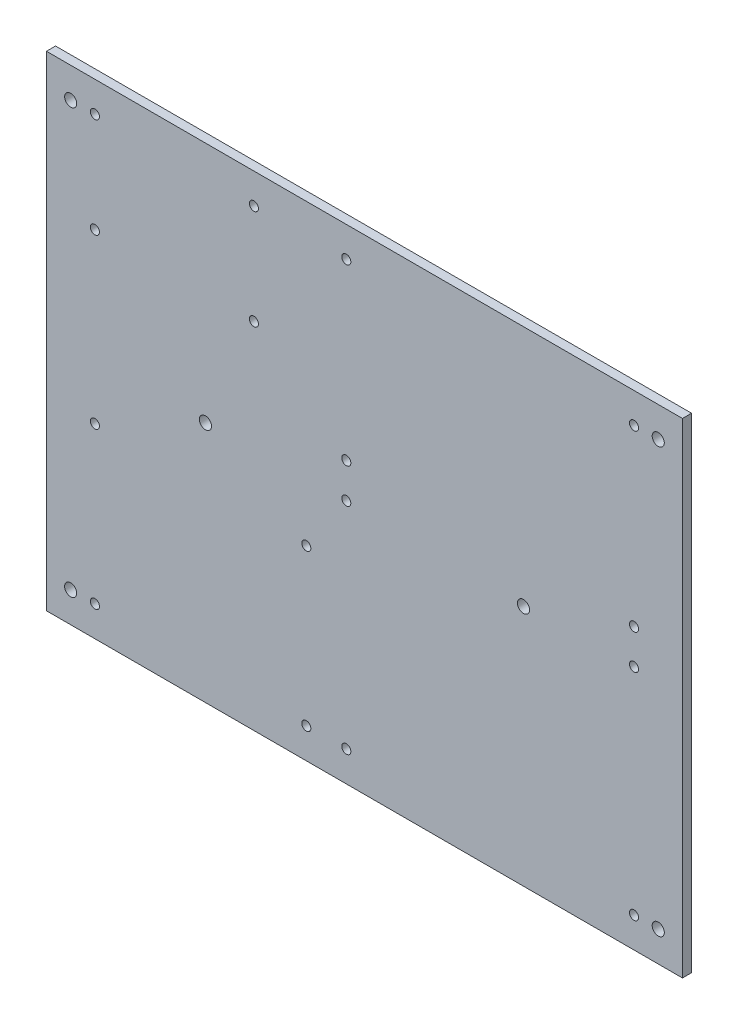
ISO-10303-21;
HEADER;
FILE_DESCRIPTION(('STEP AP214'),'2;1');
FILE_NAME('part.step','',(''),(''),'','','');
FILE_SCHEMA(('AUTOMOTIVE_DESIGN { 1 0 10303 214 1 1 1 1 }'));
ENDSEC;
DATA;
#1=APPLICATION_CONTEXT('core data for automotive mechanical design processes');
#2=APPLICATION_PROTOCOL_DEFINITION('international standard','automotive_design',2000,#1);
#3=PRODUCT_CONTEXT('',#1,'mechanical');
#4=PRODUCT('Part','Part','',(#3));
#5=PRODUCT_RELATED_PRODUCT_CATEGORY('part','',(#4));
#6=PRODUCT_DEFINITION_FORMATION('','',#4);
#7=PRODUCT_DEFINITION_CONTEXT('part definition',#1,'design');
#8=PRODUCT_DEFINITION('design','',#6,#7);
#9=PRODUCT_DEFINITION_SHAPE('','',#8);
#10=(LENGTH_UNIT() NAMED_UNIT(*) SI_UNIT(.MILLI.,.METRE.));
#11=(NAMED_UNIT(*) PLANE_ANGLE_UNIT() SI_UNIT($,.RADIAN.));
#12=(NAMED_UNIT(*) SI_UNIT($,.STERADIAN.) SOLID_ANGLE_UNIT());
#13=UNCERTAINTY_MEASURE_WITH_UNIT(LENGTH_MEASURE(1.E-05),#10,'distance_accuracy_value','');
#14=(GEOMETRIC_REPRESENTATION_CONTEXT(3) GLOBAL_UNCERTAINTY_ASSIGNED_CONTEXT((#13)) GLOBAL_UNIT_ASSIGNED_CONTEXT((#10,
#11,#12)) REPRESENTATION_CONTEXT('',''));
#15=CARTESIAN_POINT('',(0.,0.,0.));
#16=DIRECTION('',(0.,0.,1.));
#17=DIRECTION('',(1.,0.,0.));
#18=AXIS2_PLACEMENT_3D('',#15,#16,#17);
#19=CARTESIAN_POINT('',(105.,0.,3.));
#20=DIRECTION('',(1.,0.,0.));
#21=DIRECTION('',(0.,1.,0.));
#22=AXIS2_PLACEMENT_3D('',#19,#20,#21);
#23=PLANE('',#22);
#24=DIRECTION('',(0.,-1.,0.));
#25=VECTOR('',#24,1.);
#26=CARTESIAN_POINT('',(105.,0.,0.));
#27=LINE('',#26,#25);
#28=CARTESIAN_POINT('',(105.,80.,0.));
#29=VERTEX_POINT('',#28);
#30=CARTESIAN_POINT('',(105.,-80.,0.));
#31=VERTEX_POINT('',#30);
#32=EDGE_CURVE('E144',#29,#31,#27,.T.);
#33=ORIENTED_EDGE('',*,*,#32,.F.);
#34=DIRECTION('',(0.,0.,-1.));
#35=VECTOR('',#34,1.);
#36=CARTESIAN_POINT('',(105.,80.,3.));
#37=LINE('',#36,#35);
#38=CARTESIAN_POINT('',(105.,80.,3.));
#39=VERTEX_POINT('',#38);
#40=EDGE_CURVE('E11',#39,#29,#37,.T.);
#41=ORIENTED_EDGE('',*,*,#40,.F.);
#42=DIRECTION('',(0.,-1.,0.));
#43=VECTOR('',#42,1.);
#44=CARTESIAN_POINT('',(105.,0.,3.));
#45=LINE('',#44,#43);
#46=CARTESIAN_POINT('',(105.,-80.,3.));
#47=VERTEX_POINT('',#46);
#48=EDGE_CURVE('E109',#39,#47,#45,.T.);
#49=ORIENTED_EDGE('',*,*,#48,.T.);
#50=DIRECTION('',(0.,0.,-1.));
#51=VECTOR('',#50,1.);
#52=CARTESIAN_POINT('',(105.,-80.,3.));
#53=LINE('',#52,#51);
#54=EDGE_CURVE('E84',#47,#31,#53,.T.);
#55=ORIENTED_EDGE('',*,*,#54,.T.);
#56=EDGE_LOOP('',(#33,#41,#49,#55));
#57=FACE_BOUND('',#56,.T.);
#58=ADVANCED_FACE('F41',(#57),#23,.T.);
#59=CARTESIAN_POINT('',(0.,80.,3.));
#60=DIRECTION('',(0.,1.,0.));
#61=DIRECTION('',(0.,0.,1.));
#62=AXIS2_PLACEMENT_3D('',#59,#60,#61);
#63=PLANE('',#62);
#64=DIRECTION('',(1.,0.,0.));
#65=VECTOR('',#64,1.);
#66=CARTESIAN_POINT('',(0.,80.,0.));
#67=LINE('',#66,#65);
#68=CARTESIAN_POINT('',(-105.,80.,0.));
#69=VERTEX_POINT('',#68);
#70=EDGE_CURVE('E96',#69,#29,#67,.T.);
#71=ORIENTED_EDGE('',*,*,#70,.F.);
#72=DIRECTION('',(0.,0.,-1.));
#73=VECTOR('',#72,1.);
#74=CARTESIAN_POINT('',(-105.,80.,3.));
#75=LINE('',#74,#73);
#76=CARTESIAN_POINT('',(-105.,80.,3.));
#77=VERTEX_POINT('',#76);
#78=EDGE_CURVE('E52',#77,#69,#75,.T.);
#79=ORIENTED_EDGE('',*,*,#78,.F.);
#80=DIRECTION('',(1.,0.,0.));
#81=VECTOR('',#80,1.);
#82=CARTESIAN_POINT('',(0.,80.,3.));
#83=LINE('',#82,#81);
#84=EDGE_CURVE('E94',#77,#39,#83,.T.);
#85=ORIENTED_EDGE('',*,*,#84,.T.);
#86=ORIENTED_EDGE('',*,*,#40,.T.);
#87=EDGE_LOOP('',(#71,#79,#85,#86));
#88=FACE_BOUND('',#87,.T.);
#89=ADVANCED_FACE('F92',(#88),#63,.T.);
#90=CARTESIAN_POINT('',(-105.,0.,3.));
#91=DIRECTION('',(1.,0.,0.));
#92=DIRECTION('',(0.,0.,-1.));
#93=AXIS2_PLACEMENT_3D('',#90,#91,#92);
#94=PLANE('',#93);
#95=DIRECTION('',(0.,-1.,0.));
#96=VECTOR('',#95,1.);
#97=CARTESIAN_POINT('',(-105.,0.,0.));
#98=LINE('',#97,#96);
#99=CARTESIAN_POINT('',(-105.,-80.,0.));
#100=VERTEX_POINT('',#99);
#101=EDGE_CURVE('E149',#69,#100,#98,.T.);
#102=ORIENTED_EDGE('',*,*,#101,.T.);
#103=DIRECTION('',(0.,0.,-1.));
#104=VECTOR('',#103,1.);
#105=CARTESIAN_POINT('',(-105.,-80.,3.));
#106=LINE('',#105,#104);
#107=CARTESIAN_POINT('',(-105.,-80.,3.));
#108=VERTEX_POINT('',#107);
#109=EDGE_CURVE('E100',#108,#100,#106,.T.);
#110=ORIENTED_EDGE('',*,*,#109,.F.);
#111=DIRECTION('',(0.,-1.,0.));
#112=VECTOR('',#111,1.);
#113=CARTESIAN_POINT('',(-105.,0.,3.));
#114=LINE('',#113,#112);
#115=EDGE_CURVE('E103',#77,#108,#114,.T.);
#116=ORIENTED_EDGE('',*,*,#115,.F.);
#117=ORIENTED_EDGE('',*,*,#78,.T.);
#118=EDGE_LOOP('',(#102,#110,#116,#117));
#119=FACE_BOUND('',#118,.T.);
#120=ADVANCED_FACE('F104',(#119),#94,.F.);
#121=CARTESIAN_POINT('',(-52.5,0.,3.));
#122=DIRECTION('',(0.,0.,-1.));
#123=DIRECTION('',(-1.,0.,0.));
#124=AXIS2_PLACEMENT_3D('',#121,#122,#123);
#125=CYLINDRICAL_SURFACE('',#124,2.);
#126=CARTESIAN_POINT('',(-52.5,0.,3.));
#127=DIRECTION('',(0.,0.,1.));
#128=DIRECTION('',(1.,0.,0.));
#129=AXIS2_PLACEMENT_3D('',#126,#127,#128);
#130=CIRCLE('',#129,2.);
#131=CARTESIAN_POINT('',(-50.5,0.,3.));
#132=VERTEX_POINT('',#131);
#133=EDGE_CURVE('E127',#132,#132,#130,.T.);
#134=ORIENTED_EDGE('',*,*,#133,.T.);
#135=EDGE_LOOP('',(#134));
#136=FACE_BOUND('',#135,.T.);
#137=CARTESIAN_POINT('',(-52.5,0.,0.));
#138=DIRECTION('',(0.,0.,1.));
#139=DIRECTION('',(1.,0.,0.));
#140=AXIS2_PLACEMENT_3D('',#137,#138,#139);
#141=CIRCLE('',#140,2.);
#142=CARTESIAN_POINT('',(-50.5,0.,0.));
#143=VERTEX_POINT('',#142);
#144=EDGE_CURVE('E162',#143,#143,#141,.T.);
#145=ORIENTED_EDGE('',*,*,#144,.F.);
#146=EDGE_LOOP('',(#145));
#147=FACE_BOUND('',#146,.T.);
#148=ADVANCED_FACE('F338',(#136,#147),#125,.F.);
#149=CARTESIAN_POINT('',(-97.,-70.,3.));
#150=DIRECTION('',(0.,0.,-1.));
#151=DIRECTION('',(-1.,0.,0.));
#152=AXIS2_PLACEMENT_3D('',#149,#150,#151);
#153=CYLINDRICAL_SURFACE('',#152,2.);
#154=CARTESIAN_POINT('',(-97.,-70.,3.));
#155=DIRECTION('',(0.,0.,1.));
#156=DIRECTION('',(1.,0.,0.));
#157=AXIS2_PLACEMENT_3D('',#154,#155,#156);
#158=CIRCLE('',#157,2.);
#159=CARTESIAN_POINT('',(-95.,-70.,3.));
#160=VERTEX_POINT('',#159);
#161=EDGE_CURVE('E123',#160,#160,#158,.F.);
#162=ORIENTED_EDGE('',*,*,#161,.F.);
#163=EDGE_LOOP('',(#162));
#164=FACE_BOUND('',#163,.T.);
#165=CARTESIAN_POINT('',(-97.,-70.,0.));
#166=DIRECTION('',(0.,0.,1.));
#167=DIRECTION('',(1.,0.,0.));
#168=AXIS2_PLACEMENT_3D('',#165,#166,#167);
#169=CIRCLE('',#168,2.);
#170=CARTESIAN_POINT('',(-95.,-70.,0.));
#171=VERTEX_POINT('',#170);
#172=EDGE_CURVE('E158',#171,#171,#169,.F.);
#173=ORIENTED_EDGE('',*,*,#172,.T.);
#174=EDGE_LOOP('',(#173));
#175=FACE_BOUND('',#174,.T.);
#176=ADVANCED_FACE('F333',(#164,#175),#153,.F.);
#177=CARTESIAN_POINT('',(-97.,70.,3.));
#178=DIRECTION('',(0.,0.,-1.));
#179=DIRECTION('',(-1.,0.,0.));
#180=AXIS2_PLACEMENT_3D('',#177,#178,#179);
#181=CYLINDRICAL_SURFACE('',#180,2.);
#182=CARTESIAN_POINT('',(-97.,70.,3.));
#183=DIRECTION('',(0.,0.,1.));
#184=DIRECTION('',(1.,0.,0.));
#185=AXIS2_PLACEMENT_3D('',#182,#183,#184);
#186=CIRCLE('',#185,2.);
#187=CARTESIAN_POINT('',(-95.,70.,3.));
#188=VERTEX_POINT('',#187);
#189=EDGE_CURVE('E119',#188,#188,#186,.T.);
#190=ORIENTED_EDGE('',*,*,#189,.T.);
#191=EDGE_LOOP('',(#190));
#192=FACE_BOUND('',#191,.T.);
#193=CARTESIAN_POINT('',(-97.,70.,0.));
#194=DIRECTION('',(0.,0.,1.));
#195=DIRECTION('',(1.,0.,0.));
#196=AXIS2_PLACEMENT_3D('',#193,#194,#195);
#197=CIRCLE('',#196,2.);
#198=CARTESIAN_POINT('',(-95.,70.,0.));
#199=VERTEX_POINT('',#198);
#200=EDGE_CURVE('E154',#199,#199,#197,.T.);
#201=ORIENTED_EDGE('',*,*,#200,.F.);
#202=EDGE_LOOP('',(#201));
#203=FACE_BOUND('',#202,.T.);
#204=ADVANCED_FACE('F327',(#192,#203),#181,.F.);
#205=CARTESIAN_POINT('',(0.,-80.,3.));
#206=DIRECTION('',(0.,1.,0.));
#207=DIRECTION('',(0.,0.,1.));
#208=AXIS2_PLACEMENT_3D('',#205,#206,#207);
#209=PLANE('',#208);
#210=DIRECTION('',(1.,0.,0.));
#211=VECTOR('',#210,1.);
#212=CARTESIAN_POINT('',(0.,-80.,0.));
#213=LINE('',#212,#211);
#214=EDGE_CURVE('E77',#100,#31,#213,.T.);
#215=ORIENTED_EDGE('',*,*,#214,.T.);
#216=ORIENTED_EDGE('',*,*,#54,.F.);
#217=DIRECTION('',(1.,0.,0.));
#218=VECTOR('',#217,1.);
#219=CARTESIAN_POINT('',(0.,-80.,3.));
#220=LINE('',#219,#218);
#221=EDGE_CURVE('E61',#108,#47,#220,.T.);
#222=ORIENTED_EDGE('',*,*,#221,.F.);
#223=ORIENTED_EDGE('',*,*,#109,.T.);
#224=EDGE_LOOP('',(#215,#216,#222,#223));
#225=FACE_BOUND('',#224,.T.);
#226=ADVANCED_FACE('F321',(#225),#209,.F.);
#227=CARTESIAN_POINT('',(97.,-70.,3.));
#228=DIRECTION('',(0.,0.,-1.));
#229=DIRECTION('',(-1.,0.,0.));
#230=AXIS2_PLACEMENT_3D('',#227,#228,#229);
#231=CYLINDRICAL_SURFACE('',#230,2.);
#232=CARTESIAN_POINT('',(97.,-70.,3.));
#233=DIRECTION('',(0.,0.,1.));
#234=DIRECTION('',(1.,0.,0.));
#235=AXIS2_PLACEMENT_3D('',#232,#233,#234);
#236=CIRCLE('',#235,2.);
#237=CARTESIAN_POINT('',(99.,-70.,3.));
#238=VERTEX_POINT('',#237);
#239=EDGE_CURVE('E113',#238,#238,#236,.T.);
#240=ORIENTED_EDGE('',*,*,#239,.T.);
#241=EDGE_LOOP('',(#240));
#242=FACE_BOUND('',#241,.T.);
#243=CARTESIAN_POINT('',(97.,-70.,0.));
#244=DIRECTION('',(0.,0.,1.));
#245=DIRECTION('',(1.,0.,0.));
#246=AXIS2_PLACEMENT_3D('',#243,#244,#245);
#247=CIRCLE('',#246,2.);
#248=CARTESIAN_POINT('',(99.,-70.,0.));
#249=VERTEX_POINT('',#248);
#250=EDGE_CURVE('E139',#249,#249,#247,.T.);
#251=ORIENTED_EDGE('',*,*,#250,.F.);
#252=EDGE_LOOP('',(#251));
#253=FACE_BOUND('',#252,.T.);
#254=ADVANCED_FACE('F294',(#242,#253),#231,.F.);
#255=CARTESIAN_POINT('',(97.,70.,3.));
#256=DIRECTION('',(0.,0.,-1.));
#257=DIRECTION('',(-1.,0.,0.));
#258=AXIS2_PLACEMENT_3D('',#255,#256,#257);
#259=CYLINDRICAL_SURFACE('',#258,2.);
#260=CARTESIAN_POINT('',(97.,70.,3.));
#261=DIRECTION('',(0.,0.,1.));
#262=DIRECTION('',(1.,0.,0.));
#263=AXIS2_PLACEMENT_3D('',#260,#261,#262);
#264=CIRCLE('',#263,2.);
#265=CARTESIAN_POINT('',(99.,70.,3.));
#266=VERTEX_POINT('',#265);
#267=EDGE_CURVE('E170',#266,#266,#264,.F.);
#268=ORIENTED_EDGE('',*,*,#267,.F.);
#269=EDGE_LOOP('',(#268));
#270=FACE_BOUND('',#269,.T.);
#271=CARTESIAN_POINT('',(97.,70.,0.));
#272=DIRECTION('',(0.,0.,1.));
#273=DIRECTION('',(1.,0.,0.));
#274=AXIS2_PLACEMENT_3D('',#271,#272,#273);
#275=CIRCLE('',#274,2.);
#276=CARTESIAN_POINT('',(99.,70.,0.));
#277=VERTEX_POINT('',#276);
#278=EDGE_CURVE('E135',#277,#277,#275,.F.);
#279=ORIENTED_EDGE('',*,*,#278,.T.);
#280=EDGE_LOOP('',(#279));
#281=FACE_BOUND('',#280,.T.);
#282=ADVANCED_FACE('F43',(#270,#281),#259,.F.);
#283=CARTESIAN_POINT('',(52.5,0.,3.));
#284=DIRECTION('',(0.,0.,-1.));
#285=DIRECTION('',(-1.,0.,0.));
#286=AXIS2_PLACEMENT_3D('',#283,#284,#285);
#287=CYLINDRICAL_SURFACE('',#286,2.);
#288=CARTESIAN_POINT('',(52.5,0.,3.));
#289=DIRECTION('',(0.,0.,1.));
#290=DIRECTION('',(1.,0.,0.));
#291=AXIS2_PLACEMENT_3D('',#288,#289,#290);
#292=CIRCLE('',#291,2.);
#293=CARTESIAN_POINT('',(54.5,0.,3.));
#294=VERTEX_POINT('',#293);
#295=EDGE_CURVE('E131',#294,#294,#292,.F.);
#296=ORIENTED_EDGE('',*,*,#295,.F.);
#297=EDGE_LOOP('',(#296));
#298=FACE_BOUND('',#297,.T.);
#299=CARTESIAN_POINT('',(52.5,0.,0.));
#300=DIRECTION('',(0.,0.,1.));
#301=DIRECTION('',(1.,0.,0.));
#302=AXIS2_PLACEMENT_3D('',#299,#300,#301);
#303=CIRCLE('',#302,2.);
#304=CARTESIAN_POINT('',(54.5,0.,0.));
#305=VERTEX_POINT('',#304);
#306=EDGE_CURVE('E166',#305,#305,#303,.F.);
#307=ORIENTED_EDGE('',*,*,#306,.T.);
#308=EDGE_LOOP('',(#307));
#309=FACE_BOUND('',#308,.T.);
#310=ADVANCED_FACE('F299',(#298,#309),#287,.F.);
#311=CARTESIAN_POINT('',(0.,0.,3.));
#312=DIRECTION('',(0.,0.,1.));
#313=DIRECTION('',(1.,0.,0.));
#314=AXIS2_PLACEMENT_3D('',#311,#312,#313);
#315=PLANE('',#314);
#316=CARTESIAN_POINT('',(-36.5,70.,3.));
#317=DIRECTION('',(0.,0.,1.));
#318=DIRECTION('',(1.,0.,0.));
#319=AXIS2_PLACEMENT_3D('',#316,#317,#318);
#320=CIRCLE('',#319,1.5);
#321=CARTESIAN_POINT('',(-35.,70.,3.));
#322=VERTEX_POINT('',#321);
#323=EDGE_CURVE('E562',#322,#322,#320,.T.);
#324=ORIENTED_EDGE('',*,*,#323,.F.);
#325=EDGE_LOOP('',(#324));
#326=FACE_BOUND('',#325,.T.);
#327=CARTESIAN_POINT('',(-89.,37.,3.));
#328=DIRECTION('',(0.,0.,1.));
#329=DIRECTION('',(1.,0.,0.));
#330=AXIS2_PLACEMENT_3D('',#327,#328,#329);
#331=CIRCLE('',#330,1.5);
#332=CARTESIAN_POINT('',(-87.5,37.,3.));
#333=VERTEX_POINT('',#332);
#334=EDGE_CURVE('E564',#333,#333,#331,.T.);
#335=ORIENTED_EDGE('',*,*,#334,.F.);
#336=EDGE_LOOP('',(#335));
#337=FACE_BOUND('',#336,.T.);
#338=CARTESIAN_POINT('',(-36.5,37.,3.));
#339=DIRECTION('',(0.,0.,1.));
#340=DIRECTION('',(1.,0.,0.));
#341=AXIS2_PLACEMENT_3D('',#338,#339,#340);
#342=CIRCLE('',#341,1.5);
#343=CARTESIAN_POINT('',(-35.,37.,3.));
#344=VERTEX_POINT('',#343);
#345=EDGE_CURVE('E571',#344,#344,#342,.T.);
#346=ORIENTED_EDGE('',*,*,#345,.F.);
#347=EDGE_LOOP('',(#346));
#348=FACE_BOUND('',#347,.T.);
#349=CARTESIAN_POINT('',(-89.,70.,3.));
#350=DIRECTION('',(0.,0.,1.));
#351=DIRECTION('',(1.,0.,0.));
#352=AXIS2_PLACEMENT_3D('',#349,#350,#351);
#353=CIRCLE('',#352,1.5);
#354=CARTESIAN_POINT('',(-87.5,70.,3.));
#355=VERTEX_POINT('',#354);
#356=EDGE_CURVE('E232',#355,#355,#353,.T.);
#357=ORIENTED_EDGE('',*,*,#356,.F.);
#358=EDGE_LOOP('',(#357));
#359=FACE_BOUND('',#358,.T.);
#360=CARTESIAN_POINT('',(-89.,-70.,3.));
#361=DIRECTION('',(0.,0.,1.));
#362=DIRECTION('',(1.,0.,0.));
#363=AXIS2_PLACEMENT_3D('',#360,#361,#362);
#364=CIRCLE('',#363,1.50000000000001);
#365=CARTESIAN_POINT('',(-87.5,-70.,3.));
#366=VERTEX_POINT('',#365);
#367=EDGE_CURVE('E242',#366,#366,#364,.T.);
#368=ORIENTED_EDGE('',*,*,#367,.F.);
#369=EDGE_LOOP('',(#368));
#370=FACE_BOUND('',#369,.T.);
#371=CARTESIAN_POINT('',(-19.2,-70.,3.));
#372=DIRECTION('',(0.,0.,1.));
#373=DIRECTION('',(1.,0.,0.));
#374=AXIS2_PLACEMENT_3D('',#371,#372,#373);
#375=CIRCLE('',#374,1.5);
#376=CARTESIAN_POINT('',(-17.7,-70.,3.));
#377=VERTEX_POINT('',#376);
#378=EDGE_CURVE('E247',#377,#377,#375,.T.);
#379=ORIENTED_EDGE('',*,*,#378,.F.);
#380=EDGE_LOOP('',(#379));
#381=FACE_BOUND('',#380,.T.);
#382=CARTESIAN_POINT('',(-19.2,-18.5,3.));
#383=DIRECTION('',(0.,0.,1.));
#384=DIRECTION('',(1.,0.,0.));
#385=AXIS2_PLACEMENT_3D('',#382,#383,#384);
#386=CIRCLE('',#385,1.50000000000001);
#387=CARTESIAN_POINT('',(-17.7,-18.5,3.));
#388=VERTEX_POINT('',#387);
#389=EDGE_CURVE('E253',#388,#388,#386,.T.);
#390=ORIENTED_EDGE('',*,*,#389,.F.);
#391=EDGE_LOOP('',(#390));
#392=FACE_BOUND('',#391,.T.);
#393=CARTESIAN_POINT('',(-89.,-18.5,3.));
#394=DIRECTION('',(0.,0.,1.));
#395=DIRECTION('',(1.,0.,0.));
#396=AXIS2_PLACEMENT_3D('',#393,#394,#395);
#397=CIRCLE('',#396,1.5);
#398=CARTESIAN_POINT('',(-87.5,-18.5,3.));
#399=VERTEX_POINT('',#398);
#400=EDGE_CURVE('E214',#399,#399,#397,.T.);
#401=ORIENTED_EDGE('',*,*,#400,.F.);
#402=EDGE_LOOP('',(#401));
#403=FACE_BOUND('',#402,.T.);
#404=CARTESIAN_POINT('',(89.,0.999999999999973,3.));
#405=DIRECTION('',(0.,0.,1.));
#406=DIRECTION('',(1.,0.,0.));
#407=AXIS2_PLACEMENT_3D('',#404,#405,#406);
#408=CIRCLE('',#407,1.5);
#409=CARTESIAN_POINT('',(90.5,0.999999999999973,3.));
#410=VERTEX_POINT('',#409);
#411=EDGE_CURVE('E264',#410,#410,#408,.T.);
#412=ORIENTED_EDGE('',*,*,#411,.F.);
#413=EDGE_LOOP('',(#412));
#414=FACE_BOUND('',#413,.T.);
#415=CARTESIAN_POINT('',(-6.00000000000002,-70.,3.));
#416=DIRECTION('',(0.,0.,1.));
#417=DIRECTION('',(1.,0.,0.));
#418=AXIS2_PLACEMENT_3D('',#415,#416,#417);
#419=CIRCLE('',#418,1.5);
#420=CARTESIAN_POINT('',(-4.50000000000002,-70.,3.));
#421=VERTEX_POINT('',#420);
#422=EDGE_CURVE('E263',#421,#421,#419,.T.);
#423=ORIENTED_EDGE('',*,*,#422,.F.);
#424=EDGE_LOOP('',(#423));
#425=FACE_BOUND('',#424,.T.);
#426=CARTESIAN_POINT('',(89.,-70.,3.));
#427=DIRECTION('',(0.,0.,1.));
#428=DIRECTION('',(1.,0.,0.));
#429=AXIS2_PLACEMENT_3D('',#426,#427,#428);
#430=CIRCLE('',#429,1.5);
#431=CARTESIAN_POINT('',(90.5,-70.,3.));
#432=VERTEX_POINT('',#431);
#433=EDGE_CURVE('E226',#432,#432,#430,.T.);
#434=ORIENTED_EDGE('',*,*,#433,.F.);
#435=EDGE_LOOP('',(#434));
#436=FACE_BOUND('',#435,.T.);
#437=CARTESIAN_POINT('',(-6.00000000000002,0.999999999999973,3.));
#438=DIRECTION('',(0.,0.,1.));
#439=DIRECTION('',(1.,0.,0.));
#440=AXIS2_PLACEMENT_3D('',#437,#438,#439);
#441=CIRCLE('',#440,1.5);
#442=CARTESIAN_POINT('',(-4.50000000000002,0.999999999999973,3.));
#443=VERTEX_POINT('',#442);
#444=EDGE_CURVE('E196',#443,#443,#441,.T.);
#445=ORIENTED_EDGE('',*,*,#444,.F.);
#446=EDGE_LOOP('',(#445));
#447=FACE_BOUND('',#446,.T.);
#448=CARTESIAN_POINT('',(89.,70.,3.));
#449=DIRECTION('',(0.,0.,1.));
#450=DIRECTION('',(1.,0.,0.));
#451=AXIS2_PLACEMENT_3D('',#448,#449,#450);
#452=CIRCLE('',#451,1.5);
#453=CARTESIAN_POINT('',(90.5,70.,3.));
#454=VERTEX_POINT('',#453);
#455=EDGE_CURVE('E278',#454,#454,#452,.T.);
#456=ORIENTED_EDGE('',*,*,#455,.F.);
#457=EDGE_LOOP('',(#456));
#458=FACE_BOUND('',#457,.T.);
#459=CARTESIAN_POINT('',(-6.00000000000002,12.5,3.));
#460=DIRECTION('',(0.,0.,1.));
#461=DIRECTION('',(1.,0.,0.));
#462=AXIS2_PLACEMENT_3D('',#459,#460,#461);
#463=CIRCLE('',#462,1.5);
#464=CARTESIAN_POINT('',(-4.50000000000002,12.5,3.));
#465=VERTEX_POINT('',#464);
#466=EDGE_CURVE('E277',#465,#465,#463,.T.);
#467=ORIENTED_EDGE('',*,*,#466,.F.);
#468=EDGE_LOOP('',(#467));
#469=FACE_BOUND('',#468,.T.);
#470=CARTESIAN_POINT('',(89.,12.5,3.));
#471=DIRECTION('',(0.,0.,1.));
#472=DIRECTION('',(1.,0.,0.));
#473=AXIS2_PLACEMENT_3D('',#470,#471,#472);
#474=CIRCLE('',#473,1.5);
#475=CARTESIAN_POINT('',(90.5,12.5,3.));
#476=VERTEX_POINT('',#475);
#477=EDGE_CURVE('E208',#476,#476,#474,.T.);
#478=ORIENTED_EDGE('',*,*,#477,.F.);
#479=EDGE_LOOP('',(#478));
#480=FACE_BOUND('',#479,.T.);
#481=CARTESIAN_POINT('',(-6.00000000000002,70.,3.));
#482=DIRECTION('',(0.,0.,1.));
#483=DIRECTION('',(1.,0.,0.));
#484=AXIS2_PLACEMENT_3D('',#481,#482,#483);
#485=CIRCLE('',#484,1.5);
#486=CARTESIAN_POINT('',(-4.50000000000002,70.,3.));
#487=VERTEX_POINT('',#486);
#488=EDGE_CURVE('E180',#487,#487,#485,.T.);
#489=ORIENTED_EDGE('',*,*,#488,.F.);
#490=EDGE_LOOP('',(#489));
#491=FACE_BOUND('',#490,.T.);
#492=ORIENTED_EDGE('',*,*,#267,.T.);
#493=EDGE_LOOP('',(#492));
#494=FACE_BOUND('',#493,.T.);
#495=ORIENTED_EDGE('',*,*,#239,.F.);
#496=EDGE_LOOP('',(#495));
#497=FACE_BOUND('',#496,.T.);
#498=ORIENTED_EDGE('',*,*,#48,.F.);
#499=ORIENTED_EDGE('',*,*,#84,.F.);
#500=ORIENTED_EDGE('',*,*,#115,.T.);
#501=ORIENTED_EDGE('',*,*,#221,.T.);
#502=EDGE_LOOP('',(#498,#499,#500,#501));
#503=FACE_BOUND('',#502,.T.);
#504=ORIENTED_EDGE('',*,*,#189,.F.);
#505=EDGE_LOOP('',(#504));
#506=FACE_BOUND('',#505,.T.);
#507=ORIENTED_EDGE('',*,*,#161,.T.);
#508=EDGE_LOOP('',(#507));
#509=FACE_BOUND('',#508,.T.);
#510=ORIENTED_EDGE('',*,*,#133,.F.);
#511=EDGE_LOOP('',(#510));
#512=FACE_BOUND('',#511,.T.);
#513=ORIENTED_EDGE('',*,*,#295,.T.);
#514=EDGE_LOOP('',(#513));
#515=FACE_BOUND('',#514,.T.);
#516=ADVANCED_FACE('F107',(#326,#337,#348,#359,#370,#381,#392,#403,#414,#425,#436,#447,#458,
#469,#480,#491,#494,#497,#503,#506,#509,#512,#515),#315,.T.);
#517=CARTESIAN_POINT('',(0.,0.,0.));
#518=DIRECTION('',(0.,0.,1.));
#519=DIRECTION('',(1.,0.,0.));
#520=AXIS2_PLACEMENT_3D('',#517,#518,#519);
#521=PLANE('',#520);
#522=CARTESIAN_POINT('',(-36.5,70.,0.));
#523=DIRECTION('',(0.,0.,1.));
#524=DIRECTION('',(1.,0.,0.));
#525=AXIS2_PLACEMENT_3D('',#522,#523,#524);
#526=CIRCLE('',#525,1.5);
#527=CARTESIAN_POINT('',(-35.,70.,0.));
#528=VERTEX_POINT('',#527);
#529=EDGE_CURVE('E45',#528,#528,#526,.T.);
#530=ORIENTED_EDGE('',*,*,#529,.T.);
#531=EDGE_LOOP('',(#530));
#532=FACE_BOUND('',#531,.T.);
#533=CARTESIAN_POINT('',(-89.,37.,0.));
#534=DIRECTION('',(0.,0.,1.));
#535=DIRECTION('',(1.,0.,0.));
#536=AXIS2_PLACEMENT_3D('',#533,#534,#535);
#537=CIRCLE('',#536,1.5);
#538=CARTESIAN_POINT('',(-87.5,37.,0.));
#539=VERTEX_POINT('',#538);
#540=EDGE_CURVE('E235',#539,#539,#537,.T.);
#541=ORIENTED_EDGE('',*,*,#540,.T.);
#542=EDGE_LOOP('',(#541));
#543=FACE_BOUND('',#542,.T.);
#544=CARTESIAN_POINT('',(-36.5,37.,0.));
#545=DIRECTION('',(0.,0.,1.));
#546=DIRECTION('',(1.,0.,0.));
#547=AXIS2_PLACEMENT_3D('',#544,#545,#546);
#548=CIRCLE('',#547,1.5);
#549=CARTESIAN_POINT('',(-35.,37.,0.));
#550=VERTEX_POINT('',#549);
#551=EDGE_CURVE('E231',#550,#550,#548,.T.);
#552=ORIENTED_EDGE('',*,*,#551,.T.);
#553=EDGE_LOOP('',(#552));
#554=FACE_BOUND('',#553,.T.);
#555=CARTESIAN_POINT('',(-89.,70.,0.));
#556=DIRECTION('',(0.,0.,1.));
#557=DIRECTION('',(1.,0.,0.));
#558=AXIS2_PLACEMENT_3D('',#555,#556,#557);
#559=CIRCLE('',#558,1.5);
#560=CARTESIAN_POINT('',(-87.5,70.,0.));
#561=VERTEX_POINT('',#560);
#562=EDGE_CURVE('E227',#561,#561,#559,.T.);
#563=ORIENTED_EDGE('',*,*,#562,.T.);
#564=EDGE_LOOP('',(#563));
#565=FACE_BOUND('',#564,.T.);
#566=CARTESIAN_POINT('',(-89.,-70.,0.));
#567=DIRECTION('',(0.,0.,1.));
#568=DIRECTION('',(1.,0.,0.));
#569=AXIS2_PLACEMENT_3D('',#566,#567,#568);
#570=CIRCLE('',#569,1.50000000000001);
#571=CARTESIAN_POINT('',(-87.5,-70.,0.));
#572=VERTEX_POINT('',#571);
#573=EDGE_CURVE('E222',#572,#572,#570,.T.);
#574=ORIENTED_EDGE('',*,*,#573,.T.);
#575=EDGE_LOOP('',(#574));
#576=FACE_BOUND('',#575,.T.);
#577=CARTESIAN_POINT('',(-19.2,-70.,0.));
#578=DIRECTION('',(0.,0.,1.));
#579=DIRECTION('',(1.,0.,0.));
#580=AXIS2_PLACEMENT_3D('',#577,#578,#579);
#581=CIRCLE('',#580,1.5);
#582=CARTESIAN_POINT('',(-17.7,-70.,0.));
#583=VERTEX_POINT('',#582);
#584=EDGE_CURVE('E218',#583,#583,#581,.T.);
#585=ORIENTED_EDGE('',*,*,#584,.T.);
#586=EDGE_LOOP('',(#585));
#587=FACE_BOUND('',#586,.T.);
#588=CARTESIAN_POINT('',(-19.2,-18.5,0.));
#589=DIRECTION('',(0.,0.,1.));
#590=DIRECTION('',(1.,0.,0.));
#591=AXIS2_PLACEMENT_3D('',#588,#589,#590);
#592=CIRCLE('',#591,1.50000000000001);
#593=CARTESIAN_POINT('',(-17.7,-18.5,0.));
#594=VERTEX_POINT('',#593);
#595=EDGE_CURVE('E213',#594,#594,#592,.T.);
#596=ORIENTED_EDGE('',*,*,#595,.T.);
#597=EDGE_LOOP('',(#596));
#598=FACE_BOUND('',#597,.T.);
#599=CARTESIAN_POINT('',(-89.,-18.5,0.));
#600=DIRECTION('',(0.,0.,1.));
#601=DIRECTION('',(1.,0.,0.));
#602=AXIS2_PLACEMENT_3D('',#599,#600,#601);
#603=CIRCLE('',#602,1.5);
#604=CARTESIAN_POINT('',(-87.5,-18.5,0.));
#605=VERTEX_POINT('',#604);
#606=EDGE_CURVE('E209',#605,#605,#603,.T.);
#607=ORIENTED_EDGE('',*,*,#606,.T.);
#608=EDGE_LOOP('',(#607));
#609=FACE_BOUND('',#608,.T.);
#610=CARTESIAN_POINT('',(89.,0.999999999999973,0.));
#611=DIRECTION('',(0.,0.,1.));
#612=DIRECTION('',(1.,0.,0.));
#613=AXIS2_PLACEMENT_3D('',#610,#611,#612);
#614=CIRCLE('',#613,1.5);
#615=CARTESIAN_POINT('',(90.5,0.999999999999973,0.));
#616=VERTEX_POINT('',#615);
#617=EDGE_CURVE('E204',#616,#616,#614,.T.);
#618=ORIENTED_EDGE('',*,*,#617,.T.);
#619=EDGE_LOOP('',(#618));
#620=FACE_BOUND('',#619,.T.);
#621=CARTESIAN_POINT('',(-6.00000000000002,-70.,0.));
#622=DIRECTION('',(0.,0.,1.));
#623=DIRECTION('',(1.,0.,0.));
#624=AXIS2_PLACEMENT_3D('',#621,#622,#623);
#625=CIRCLE('',#624,1.5);
#626=CARTESIAN_POINT('',(-4.50000000000002,-70.,0.));
#627=VERTEX_POINT('',#626);
#628=EDGE_CURVE('E200',#627,#627,#625,.T.);
#629=ORIENTED_EDGE('',*,*,#628,.T.);
#630=EDGE_LOOP('',(#629));
#631=FACE_BOUND('',#630,.T.);
#632=CARTESIAN_POINT('',(89.,-70.,0.));
#633=DIRECTION('',(0.,0.,1.));
#634=DIRECTION('',(1.,0.,0.));
#635=AXIS2_PLACEMENT_3D('',#632,#633,#634);
#636=CIRCLE('',#635,1.5);
#637=CARTESIAN_POINT('',(90.5,-70.,0.));
#638=VERTEX_POINT('',#637);
#639=EDGE_CURVE('E195',#638,#638,#636,.T.);
#640=ORIENTED_EDGE('',*,*,#639,.T.);
#641=EDGE_LOOP('',(#640));
#642=FACE_BOUND('',#641,.T.);
#643=CARTESIAN_POINT('',(-6.00000000000002,0.999999999999973,0.));
#644=DIRECTION('',(0.,0.,1.));
#645=DIRECTION('',(1.,0.,0.));
#646=AXIS2_PLACEMENT_3D('',#643,#644,#645);
#647=CIRCLE('',#646,1.5);
#648=CARTESIAN_POINT('',(-4.50000000000002,0.999999999999973,0.));
#649=VERTEX_POINT('',#648);
#650=EDGE_CURVE('E191',#649,#649,#647,.T.);
#651=ORIENTED_EDGE('',*,*,#650,.T.);
#652=EDGE_LOOP('',(#651));
#653=FACE_BOUND('',#652,.T.);
#654=CARTESIAN_POINT('',(89.,70.,0.));
#655=DIRECTION('',(0.,0.,1.));
#656=DIRECTION('',(1.,0.,0.));
#657=AXIS2_PLACEMENT_3D('',#654,#655,#656);
#658=CIRCLE('',#657,1.5);
#659=CARTESIAN_POINT('',(90.5,70.,0.));
#660=VERTEX_POINT('',#659);
#661=EDGE_CURVE('E140',#660,#660,#658,.T.);
#662=ORIENTED_EDGE('',*,*,#661,.T.);
#663=EDGE_LOOP('',(#662));
#664=FACE_BOUND('',#663,.T.);
#665=CARTESIAN_POINT('',(-6.00000000000002,12.5,0.));
#666=DIRECTION('',(0.,0.,1.));
#667=DIRECTION('',(1.,0.,0.));
#668=AXIS2_PLACEMENT_3D('',#665,#666,#667);
#669=CIRCLE('',#668,1.5);
#670=CARTESIAN_POINT('',(-4.50000000000002,12.5,0.));
#671=VERTEX_POINT('',#670);
#672=EDGE_CURVE('E184',#671,#671,#669,.T.);
#673=ORIENTED_EDGE('',*,*,#672,.T.);
#674=EDGE_LOOP('',(#673));
#675=FACE_BOUND('',#674,.T.);
#676=CARTESIAN_POINT('',(89.,12.5,0.));
#677=DIRECTION('',(0.,0.,1.));
#678=DIRECTION('',(1.,0.,0.));
#679=AXIS2_PLACEMENT_3D('',#676,#677,#678);
#680=CIRCLE('',#679,1.5);
#681=CARTESIAN_POINT('',(90.5,12.5,0.));
#682=VERTEX_POINT('',#681);
#683=EDGE_CURVE('E179',#682,#682,#680,.T.);
#684=ORIENTED_EDGE('',*,*,#683,.T.);
#685=EDGE_LOOP('',(#684));
#686=FACE_BOUND('',#685,.T.);
#687=CARTESIAN_POINT('',(-6.00000000000002,70.,0.));
#688=DIRECTION('',(0.,0.,1.));
#689=DIRECTION('',(1.,0.,0.));
#690=AXIS2_PLACEMENT_3D('',#687,#688,#689);
#691=CIRCLE('',#690,1.5);
#692=CARTESIAN_POINT('',(-4.50000000000002,70.,0.));
#693=VERTEX_POINT('',#692);
#694=EDGE_CURVE('E175',#693,#693,#691,.T.);
#695=ORIENTED_EDGE('',*,*,#694,.T.);
#696=EDGE_LOOP('',(#695));
#697=FACE_BOUND('',#696,.T.);
#698=ORIENTED_EDGE('',*,*,#278,.F.);
#699=EDGE_LOOP('',(#698));
#700=FACE_BOUND('',#699,.T.);
#701=ORIENTED_EDGE('',*,*,#250,.T.);
#702=EDGE_LOOP('',(#701));
#703=FACE_BOUND('',#702,.T.);
#704=ORIENTED_EDGE('',*,*,#32,.T.);
#705=ORIENTED_EDGE('',*,*,#214,.F.);
#706=ORIENTED_EDGE('',*,*,#101,.F.);
#707=ORIENTED_EDGE('',*,*,#70,.T.);
#708=EDGE_LOOP('',(#704,#705,#706,#707));
#709=FACE_BOUND('',#708,.T.);
#710=ORIENTED_EDGE('',*,*,#200,.T.);
#711=EDGE_LOOP('',(#710));
#712=FACE_BOUND('',#711,.T.);
#713=ORIENTED_EDGE('',*,*,#172,.F.);
#714=EDGE_LOOP('',(#713));
#715=FACE_BOUND('',#714,.T.);
#716=ORIENTED_EDGE('',*,*,#144,.T.);
#717=EDGE_LOOP('',(#716));
#718=FACE_BOUND('',#717,.T.);
#719=ORIENTED_EDGE('',*,*,#306,.F.);
#720=EDGE_LOOP('',(#719));
#721=FACE_BOUND('',#720,.T.);
#722=ADVANCED_FACE('F298',(#532,#543,#554,#565,#576,#587,#598,#609,#620,#631,#642,#653,#664,
#675,#686,#697,#700,#703,#709,#712,#715,#718,#721),#521,.F.);
#723=CARTESIAN_POINT('',(-6.00000000000002,70.,-17.));
#724=DIRECTION('',(0.,0.,1.));
#725=DIRECTION('',(1.,0.,0.));
#726=AXIS2_PLACEMENT_3D('',#723,#724,#725);
#727=CYLINDRICAL_SURFACE('',#726,1.5);
#728=ORIENTED_EDGE('',*,*,#488,.T.);
#729=EDGE_LOOP('',(#728));
#730=FACE_BOUND('',#729,.T.);
#731=ORIENTED_EDGE('',*,*,#694,.F.);
#732=EDGE_LOOP('',(#731));
#733=FACE_BOUND('',#732,.T.);
#734=ADVANCED_FACE('F306',(#730,#733),#727,.F.);
#735=CARTESIAN_POINT('',(89.,12.5,-17.));
#736=DIRECTION('',(0.,0.,1.));
#737=DIRECTION('',(1.,0.,0.));
#738=AXIS2_PLACEMENT_3D('',#735,#736,#737);
#739=CYLINDRICAL_SURFACE('',#738,1.5);
#740=ORIENTED_EDGE('',*,*,#477,.T.);
#741=EDGE_LOOP('',(#740));
#742=FACE_BOUND('',#741,.T.);
#743=ORIENTED_EDGE('',*,*,#683,.F.);
#744=EDGE_LOOP('',(#743));
#745=FACE_BOUND('',#744,.T.);
#746=ADVANCED_FACE('F399',(#742,#745),#739,.F.);
#747=CARTESIAN_POINT('',(-6.00000000000002,12.5,-17.));
#748=DIRECTION('',(0.,0.,1.));
#749=DIRECTION('',(1.,0.,0.));
#750=AXIS2_PLACEMENT_3D('',#747,#748,#749);
#751=CYLINDRICAL_SURFACE('',#750,1.5);
#752=ORIENTED_EDGE('',*,*,#466,.T.);
#753=EDGE_LOOP('',(#752));
#754=FACE_BOUND('',#753,.T.);
#755=ORIENTED_EDGE('',*,*,#672,.F.);
#756=EDGE_LOOP('',(#755));
#757=FACE_BOUND('',#756,.T.);
#758=ADVANCED_FACE('F409',(#754,#757),#751,.F.);
#759=CARTESIAN_POINT('',(89.,70.,-17.));
#760=DIRECTION('',(0.,0.,1.));
#761=DIRECTION('',(1.,0.,0.));
#762=AXIS2_PLACEMENT_3D('',#759,#760,#761);
#763=CYLINDRICAL_SURFACE('',#762,1.5);
#764=ORIENTED_EDGE('',*,*,#455,.T.);
#765=EDGE_LOOP('',(#764));
#766=FACE_BOUND('',#765,.T.);
#767=ORIENTED_EDGE('',*,*,#661,.F.);
#768=EDGE_LOOP('',(#767));
#769=FACE_BOUND('',#768,.T.);
#770=ADVANCED_FACE('F419',(#766,#769),#763,.F.);
#771=CARTESIAN_POINT('',(-6.00000000000002,0.999999999999973,-7.));
#772=DIRECTION('',(0.,0.,1.));
#773=DIRECTION('',(1.,0.,0.));
#774=AXIS2_PLACEMENT_3D('',#771,#772,#773);
#775=CYLINDRICAL_SURFACE('',#774,1.5);
#776=ORIENTED_EDGE('',*,*,#444,.T.);
#777=EDGE_LOOP('',(#776));
#778=FACE_BOUND('',#777,.T.);
#779=ORIENTED_EDGE('',*,*,#650,.F.);
#780=EDGE_LOOP('',(#779));
#781=FACE_BOUND('',#780,.T.);
#782=ADVANCED_FACE('F429',(#778,#781),#775,.F.);
#783=CARTESIAN_POINT('',(89.,-70.,-7.));
#784=DIRECTION('',(0.,0.,1.));
#785=DIRECTION('',(1.,0.,0.));
#786=AXIS2_PLACEMENT_3D('',#783,#784,#785);
#787=CYLINDRICAL_SURFACE('',#786,1.5);
#788=ORIENTED_EDGE('',*,*,#433,.T.);
#789=EDGE_LOOP('',(#788));
#790=FACE_BOUND('',#789,.T.);
#791=ORIENTED_EDGE('',*,*,#639,.F.);
#792=EDGE_LOOP('',(#791));
#793=FACE_BOUND('',#792,.T.);
#794=ADVANCED_FACE('F439',(#790,#793),#787,.F.);
#795=CARTESIAN_POINT('',(-6.00000000000002,-70.,-7.));
#796=DIRECTION('',(0.,0.,1.));
#797=DIRECTION('',(1.,0.,0.));
#798=AXIS2_PLACEMENT_3D('',#795,#796,#797);
#799=CYLINDRICAL_SURFACE('',#798,1.5);
#800=ORIENTED_EDGE('',*,*,#422,.T.);
#801=EDGE_LOOP('',(#800));
#802=FACE_BOUND('',#801,.T.);
#803=ORIENTED_EDGE('',*,*,#628,.F.);
#804=EDGE_LOOP('',(#803));
#805=FACE_BOUND('',#804,.T.);
#806=ADVANCED_FACE('F449',(#802,#805),#799,.F.);
#807=CARTESIAN_POINT('',(89.,0.999999999999973,-7.));
#808=DIRECTION('',(0.,0.,1.));
#809=DIRECTION('',(1.,0.,0.));
#810=AXIS2_PLACEMENT_3D('',#807,#808,#809);
#811=CYLINDRICAL_SURFACE('',#810,1.5);
#812=ORIENTED_EDGE('',*,*,#411,.T.);
#813=EDGE_LOOP('',(#812));
#814=FACE_BOUND('',#813,.T.);
#815=ORIENTED_EDGE('',*,*,#617,.F.);
#816=EDGE_LOOP('',(#815));
#817=FACE_BOUND('',#816,.T.);
#818=ADVANCED_FACE('F459',(#814,#817),#811,.F.);
#819=CARTESIAN_POINT('',(-89.,-18.5,-7.));
#820=DIRECTION('',(0.,0.,1.));
#821=DIRECTION('',(1.,0.,0.));
#822=AXIS2_PLACEMENT_3D('',#819,#820,#821);
#823=CYLINDRICAL_SURFACE('',#822,1.5);
#824=ORIENTED_EDGE('',*,*,#400,.T.);
#825=EDGE_LOOP('',(#824));
#826=FACE_BOUND('',#825,.T.);
#827=ORIENTED_EDGE('',*,*,#606,.F.);
#828=EDGE_LOOP('',(#827));
#829=FACE_BOUND('',#828,.T.);
#830=ADVANCED_FACE('F469',(#826,#829),#823,.F.);
#831=CARTESIAN_POINT('',(-19.2,-18.5,-7.));
#832=DIRECTION('',(0.,0.,1.));
#833=DIRECTION('',(1.,0.,0.));
#834=AXIS2_PLACEMENT_3D('',#831,#832,#833);
#835=CYLINDRICAL_SURFACE('',#834,1.50000000000001);
#836=ORIENTED_EDGE('',*,*,#389,.T.);
#837=EDGE_LOOP('',(#836));
#838=FACE_BOUND('',#837,.T.);
#839=ORIENTED_EDGE('',*,*,#595,.F.);
#840=EDGE_LOOP('',(#839));
#841=FACE_BOUND('',#840,.T.);
#842=ADVANCED_FACE('F479',(#838,#841),#835,.F.);
#843=CARTESIAN_POINT('',(-19.2,-70.,-7.));
#844=DIRECTION('',(0.,0.,1.));
#845=DIRECTION('',(1.,0.,0.));
#846=AXIS2_PLACEMENT_3D('',#843,#844,#845);
#847=CYLINDRICAL_SURFACE('',#846,1.5);
#848=ORIENTED_EDGE('',*,*,#378,.T.);
#849=EDGE_LOOP('',(#848));
#850=FACE_BOUND('',#849,.T.);
#851=ORIENTED_EDGE('',*,*,#584,.F.);
#852=EDGE_LOOP('',(#851));
#853=FACE_BOUND('',#852,.T.);
#854=ADVANCED_FACE('F489',(#850,#853),#847,.F.);
#855=CARTESIAN_POINT('',(-89.,-70.,-7.));
#856=DIRECTION('',(0.,0.,1.));
#857=DIRECTION('',(1.,0.,0.));
#858=AXIS2_PLACEMENT_3D('',#855,#856,#857);
#859=CYLINDRICAL_SURFACE('',#858,1.50000000000001);
#860=ORIENTED_EDGE('',*,*,#367,.T.);
#861=EDGE_LOOP('',(#860));
#862=FACE_BOUND('',#861,.T.);
#863=ORIENTED_EDGE('',*,*,#573,.F.);
#864=EDGE_LOOP('',(#863));
#865=FACE_BOUND('',#864,.T.);
#866=ADVANCED_FACE('F499',(#862,#865),#859,.F.);
#867=CARTESIAN_POINT('',(-89.,70.,-7.));
#868=DIRECTION('',(0.,0.,1.));
#869=DIRECTION('',(1.,0.,0.));
#870=AXIS2_PLACEMENT_3D('',#867,#868,#869);
#871=CYLINDRICAL_SURFACE('',#870,1.5);
#872=ORIENTED_EDGE('',*,*,#356,.T.);
#873=EDGE_LOOP('',(#872));
#874=FACE_BOUND('',#873,.T.);
#875=ORIENTED_EDGE('',*,*,#562,.F.);
#876=EDGE_LOOP('',(#875));
#877=FACE_BOUND('',#876,.T.);
#878=ADVANCED_FACE('F508',(#874,#877),#871,.F.);
#879=CARTESIAN_POINT('',(-36.5,37.,-7.));
#880=DIRECTION('',(0.,0.,1.));
#881=DIRECTION('',(1.,0.,0.));
#882=AXIS2_PLACEMENT_3D('',#879,#880,#881);
#883=CYLINDRICAL_SURFACE('',#882,1.5);
#884=ORIENTED_EDGE('',*,*,#345,.T.);
#885=EDGE_LOOP('',(#884));
#886=FACE_BOUND('',#885,.T.);
#887=ORIENTED_EDGE('',*,*,#551,.F.);
#888=EDGE_LOOP('',(#887));
#889=FACE_BOUND('',#888,.T.);
#890=ADVANCED_FACE('F526',(#886,#889),#883,.F.);
#891=CARTESIAN_POINT('',(-89.,37.,-7.));
#892=DIRECTION('',(0.,0.,1.));
#893=DIRECTION('',(1.,0.,0.));
#894=AXIS2_PLACEMENT_3D('',#891,#892,#893);
#895=CYLINDRICAL_SURFACE('',#894,1.5);
#896=ORIENTED_EDGE('',*,*,#334,.T.);
#897=EDGE_LOOP('',(#896));
#898=FACE_BOUND('',#897,.T.);
#899=ORIENTED_EDGE('',*,*,#540,.F.);
#900=EDGE_LOOP('',(#899));
#901=FACE_BOUND('',#900,.T.);
#902=ADVANCED_FACE('F536',(#898,#901),#895,.F.);
#903=CARTESIAN_POINT('',(-36.5,70.,-7.));
#904=DIRECTION('',(0.,0.,1.));
#905=DIRECTION('',(1.,0.,0.));
#906=AXIS2_PLACEMENT_3D('',#903,#904,#905);
#907=CYLINDRICAL_SURFACE('',#906,1.5);
#908=ORIENTED_EDGE('',*,*,#323,.T.);
#909=EDGE_LOOP('',(#908));
#910=FACE_BOUND('',#909,.T.);
#911=ORIENTED_EDGE('',*,*,#529,.F.);
#912=EDGE_LOOP('',(#911));
#913=FACE_BOUND('',#912,.T.);
#914=ADVANCED_FACE('F546',(#910,#913),#907,.F.);
#915=CLOSED_SHELL('',(#58,#89,#120,#148,#176,#204,#226,#254,#282,#310,#516,#722,#734,#746,#758,
#770,#782,#794,#806,#818,#830,#842,#854,#866,#878,#890,#902,#914));
#916=MANIFOLD_SOLID_BREP('B2',#915);
#917=ADVANCED_BREP_SHAPE_REPRESENTATION('',(#18,#916),#14);
#918=SHAPE_DEFINITION_REPRESENTATION(#9,#917);
ENDSEC;
END-ISO-10303-21;
